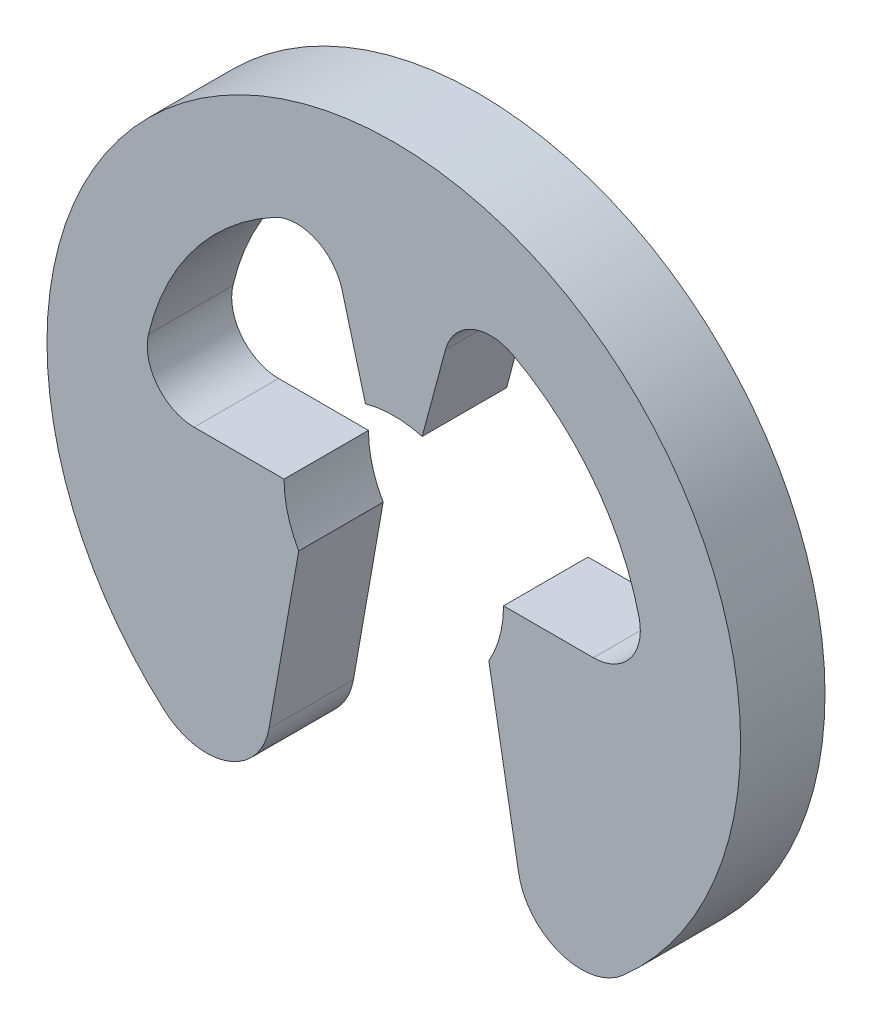
ISO-10303-21;
HEADER;
FILE_DESCRIPTION(('STEP AP214'),'2;1');
FILE_NAME('part.step','',(''),(''),'','','');
FILE_SCHEMA(('AUTOMOTIVE_DESIGN { 1 0 10303 214 1 1 1 1 }'));
ENDSEC;
DATA;
#1=APPLICATION_CONTEXT('core data for automotive mechanical design processes');
#2=APPLICATION_PROTOCOL_DEFINITION('international standard','automotive_design',2000,#1);
#3=PRODUCT_CONTEXT('',#1,'mechanical');
#4=PRODUCT('Part','Part','',(#3));
#5=PRODUCT_RELATED_PRODUCT_CATEGORY('part','',(#4));
#6=PRODUCT_DEFINITION_FORMATION('','',#4);
#7=PRODUCT_DEFINITION_CONTEXT('part definition',#1,'design');
#8=PRODUCT_DEFINITION('design','',#6,#7);
#9=PRODUCT_DEFINITION_SHAPE('','',#8);
#10=(LENGTH_UNIT() NAMED_UNIT(*) SI_UNIT(.MILLI.,.METRE.));
#11=(NAMED_UNIT(*) PLANE_ANGLE_UNIT() SI_UNIT($,.RADIAN.));
#12=(NAMED_UNIT(*) SI_UNIT($,.STERADIAN.) SOLID_ANGLE_UNIT());
#13=UNCERTAINTY_MEASURE_WITH_UNIT(LENGTH_MEASURE(1.E-05),#10,'distance_accuracy_value','');
#14=(GEOMETRIC_REPRESENTATION_CONTEXT(3) GLOBAL_UNCERTAINTY_ASSIGNED_CONTEXT((#13)) GLOBAL_UNIT_ASSIGNED_CONTEXT((#10,
#11,#12)) REPRESENTATION_CONTEXT('',''));
#15=CARTESIAN_POINT('',(0.,0.,0.));
#16=DIRECTION('',(0.,0.,1.));
#17=DIRECTION('',(1.,0.,0.));
#18=AXIS2_PLACEMENT_3D('',#15,#16,#17);
#19=CARTESIAN_POINT('',(0.600538348459495,0.141219936,-0.254));
#20=DIRECTION('',(0.,0.,1.));
#21=DIRECTION('',(1.,0.,0.));
#22=AXIS2_PLACEMENT_3D('',#19,#20,#21);
#23=CYLINDRICAL_SURFACE('',#22,0.141219936000001);
#24=CARTESIAN_POINT('',(0.600538348459495,0.141219936,0.));
#25=DIRECTION('',(0.,0.,-1.));
#26=DIRECTION('',(1.,0.,0.));
#27=AXIS2_PLACEMENT_3D('',#24,#25,#26);
#28=CIRCLE('',#27,0.141219936000001);
#29=CARTESIAN_POINT('',(0.73800850393027,0.173546808392566,0.));
#30=VERTEX_POINT('',#29);
#31=CARTESIAN_POINT('',(0.600538348459495,0.,0.));
#32=VERTEX_POINT('',#31);
#33=EDGE_CURVE('E189',#30,#32,#28,.T.);
#34=ORIENTED_EDGE('',*,*,#33,.F.);
#35=DIRECTION('',(0.,0.,1.));
#36=VECTOR('',#35,1.);
#37=CARTESIAN_POINT('',(0.73800850393027,0.173546808392566,-0.254));
#38=LINE('',#37,#36);
#39=CARTESIAN_POINT('',(0.73800850393027,0.173546808392566,-0.254));
#40=VERTEX_POINT('',#39);
#41=EDGE_CURVE('E11',#40,#30,#38,.T.);
#42=ORIENTED_EDGE('',*,*,#41,.F.);
#43=CARTESIAN_POINT('',(0.600538348459495,0.141219936,-0.254));
#44=DIRECTION('',(0.,0.,-1.));
#45=DIRECTION('',(1.,0.,0.));
#46=AXIS2_PLACEMENT_3D('',#43,#44,#45);
#47=CIRCLE('',#46,0.141219936000001);
#48=CARTESIAN_POINT('',(0.600538348459495,0.,-0.254));
#49=VERTEX_POINT('',#48);
#50=EDGE_CURVE('E239',#40,#49,#47,.T.);
#51=ORIENTED_EDGE('',*,*,#50,.T.);
#52=DIRECTION('',(0.,0.,1.));
#53=VECTOR('',#52,1.);
#54=CARTESIAN_POINT('',(0.600538348459495,0.,-0.254));
#55=LINE('',#54,#53);
#56=EDGE_CURVE('E35',#49,#32,#55,.T.);
#57=ORIENTED_EDGE('',*,*,#56,.T.);
#58=EDGE_LOOP('',(#34,#42,#51,#57));
#59=FACE_BOUND('',#58,.T.);
#60=ADVANCED_FACE('F32',(#59),#23,.F.);
#61=CARTESIAN_POINT('',(0.,0.,-0.254));
#62=DIRECTION('',(0.,0.,1.));
#63=DIRECTION('',(1.,0.,0.));
#64=AXIS2_PLACEMENT_3D('',#61,#62,#63);
#65=CYLINDRICAL_SURFACE('',#64,0.758139200000001);
#66=CARTESIAN_POINT('',(0.,0.,0.));
#67=DIRECTION('',(0.,0.,-1.));
#68=DIRECTION('',(1.,0.,0.));
#69=AXIS2_PLACEMENT_3D('',#66,#67,#68);
#70=CIRCLE('',#69,0.758139200000001);
#71=CARTESIAN_POINT('',(0.358644000561194,0.66794425473845,0.));
#72=VERTEX_POINT('',#71);
#73=EDGE_CURVE('E237',#72,#30,#70,.T.);
#74=ORIENTED_EDGE('',*,*,#73,.F.);
#75=DIRECTION('',(0.,0.,1.));
#76=VECTOR('',#75,1.);
#77=CARTESIAN_POINT('',(0.358644000561194,0.66794425473845,-0.254));
#78=LINE('',#77,#76);
#79=CARTESIAN_POINT('',(0.358644000561194,0.66794425473845,-0.254));
#80=VERTEX_POINT('',#79);
#81=EDGE_CURVE('E41',#80,#72,#78,.T.);
#82=ORIENTED_EDGE('',*,*,#81,.F.);
#83=CARTESIAN_POINT('',(0.,0.,-0.254));
#84=DIRECTION('',(0.,0.,-1.));
#85=DIRECTION('',(1.,0.,0.));
#86=AXIS2_PLACEMENT_3D('',#83,#84,#85);
#87=CIRCLE('',#86,0.758139200000001);
#88=EDGE_CURVE('E179',#80,#40,#87,.T.);
#89=ORIENTED_EDGE('',*,*,#88,.T.);
#90=ORIENTED_EDGE('',*,*,#41,.T.);
#91=EDGE_LOOP('',(#74,#82,#89,#90));
#92=FACE_BOUND('',#91,.T.);
#93=ADVANCED_FACE('F271',(#92),#65,.F.);
#94=CARTESIAN_POINT('',(0.291838745265022,0.543525091469051,-0.254));
#95=DIRECTION('',(0.,0.,1.));
#96=DIRECTION('',(1.,0.,0.));
#97=AXIS2_PLACEMENT_3D('',#94,#95,#96);
#98=CYLINDRICAL_SURFACE('',#97,0.141219936);
#99=CARTESIAN_POINT('',(0.291838745265022,0.543525091469051,0.));
#100=DIRECTION('',(0.,0.,-1.));
#101=DIRECTION('',(1.,0.,0.));
#102=AXIS2_PLACEMENT_3D('',#99,#100,#101);
#103=CIRCLE('',#102,0.141219936);
#104=CARTESIAN_POINT('',(0.155430761895732,0.58007550045401,0.));
#105=VERTEX_POINT('',#104);
#106=EDGE_CURVE('E166',#105,#72,#103,.T.);
#107=ORIENTED_EDGE('',*,*,#106,.F.);
#108=DIRECTION('',(0.,0.,1.));
#109=VECTOR('',#108,1.);
#110=CARTESIAN_POINT('',(0.155430761895732,0.58007550045401,-0.254));
#111=LINE('',#110,#109);
#112=CARTESIAN_POINT('',(0.155430761895732,0.58007550045401,-0.254));
#113=VERTEX_POINT('',#112);
#114=EDGE_CURVE('E161',#113,#105,#111,.T.);
#115=ORIENTED_EDGE('',*,*,#114,.F.);
#116=CARTESIAN_POINT('',(0.291838745265022,0.543525091469051,-0.254));
#117=DIRECTION('',(0.,0.,-1.));
#118=DIRECTION('',(1.,0.,0.));
#119=AXIS2_PLACEMENT_3D('',#116,#117,#118);
#120=CIRCLE('',#119,0.141219936);
#121=EDGE_CURVE('E164',#113,#80,#120,.T.);
#122=ORIENTED_EDGE('',*,*,#121,.T.);
#123=ORIENTED_EDGE('',*,*,#81,.T.);
#124=EDGE_LOOP('',(#107,#115,#122,#123));
#125=FACE_BOUND('',#124,.T.);
#126=ADVANCED_FACE('F163',(#125),#98,.F.);
#127=CARTESIAN_POINT('',(0.0854620486928533,0.31894870784065,-0.254));
#128=DIRECTION('',(0.965925826289069,-0.258819045102519,0.));
#129=DIRECTION('',(0.258819045102519,0.965925826289069,0.));
#130=AXIS2_PLACEMENT_3D('',#127,#128,#129);
#131=PLANE('',#130);
#132=DIRECTION('',(0.258819045102519,0.965925826289069,0.));
#133=VECTOR('',#132,1.);
#134=CARTESIAN_POINT('',(0.0854620486928533,0.31894870784065,0.));
#135=LINE('',#134,#133);
#136=CARTESIAN_POINT('',(0.0854620486928533,0.31894870784065,0.));
#137=VERTEX_POINT('',#136);
#138=EDGE_CURVE('E234',#137,#105,#135,.T.);
#139=ORIENTED_EDGE('',*,*,#138,.F.);
#140=DIRECTION('',(0.,0.,1.));
#141=VECTOR('',#140,1.);
#142=CARTESIAN_POINT('',(0.0854620486928533,0.31894870784065,-0.254));
#143=LINE('',#142,#141);
#144=CARTESIAN_POINT('',(0.0854620486928533,0.31894870784065,-0.254));
#145=VERTEX_POINT('',#144);
#146=EDGE_CURVE('E171',#145,#137,#143,.T.);
#147=ORIENTED_EDGE('',*,*,#146,.F.);
#148=DIRECTION('',(0.258819045102519,0.965925826289069,0.));
#149=VECTOR('',#148,1.);
#150=CARTESIAN_POINT('',(0.0854620486928533,0.31894870784065,-0.254));
#151=LINE('',#150,#149);
#152=EDGE_CURVE('E177',#145,#113,#151,.T.);
#153=ORIENTED_EDGE('',*,*,#152,.T.);
#154=ORIENTED_EDGE('',*,*,#114,.T.);
#155=EDGE_LOOP('',(#139,#147,#153,#154));
#156=FACE_BOUND('',#155,.T.);
#157=ADVANCED_FACE('F181',(#156),#131,.T.);
#158=CARTESIAN_POINT('',(0.,0.,-0.254));
#159=DIRECTION('',(0.,0.,1.));
#160=DIRECTION('',(1.,0.,0.));
#161=AXIS2_PLACEMENT_3D('',#158,#159,#160);
#162=CYLINDRICAL_SURFACE('',#161,0.3302);
#163=CARTESIAN_POINT('',(0.,0.,0.));
#164=DIRECTION('',(0.,0.,-1.));
#165=DIRECTION('',(-1.,0.,0.));
#166=AXIS2_PLACEMENT_3D('',#163,#164,#165);
#167=CIRCLE('',#166,0.3302);
#168=CARTESIAN_POINT('',(-0.0854620486928526,0.31894870784065,0.));
#169=VERTEX_POINT('',#168);
#170=EDGE_CURVE('E231',#169,#137,#167,.T.);
#171=ORIENTED_EDGE('',*,*,#170,.F.);
#172=DIRECTION('',(0.,0.,1.));
#173=VECTOR('',#172,1.);
#174=CARTESIAN_POINT('',(-0.0854620486928526,0.31894870784065,-0.254));
#175=LINE('',#174,#173);
#176=CARTESIAN_POINT('',(-0.0854620486928526,0.31894870784065,-0.254));
#177=VERTEX_POINT('',#176);
#178=EDGE_CURVE('E243',#177,#169,#175,.T.);
#179=ORIENTED_EDGE('',*,*,#178,.F.);
#180=CARTESIAN_POINT('',(0.,0.,-0.254));
#181=DIRECTION('',(0.,0.,-1.));
#182=DIRECTION('',(-1.,0.,0.));
#183=AXIS2_PLACEMENT_3D('',#180,#181,#182);
#184=CIRCLE('',#183,0.3302);
#185=EDGE_CURVE('E182',#177,#145,#184,.T.);
#186=ORIENTED_EDGE('',*,*,#185,.T.);
#187=ORIENTED_EDGE('',*,*,#146,.T.);
#188=EDGE_LOOP('',(#171,#179,#186,#187));
#189=FACE_BOUND('',#188,.T.);
#190=ADVANCED_FACE('F284',(#189),#162,.F.);
#191=CARTESIAN_POINT('',(-0.0854620486928526,0.31894870784065,-0.254));
#192=DIRECTION('',(-0.965925826289068,-0.258819045102522,0.));
#193=DIRECTION('',(0.258819045102522,-0.965925826289068,0.));
#194=AXIS2_PLACEMENT_3D('',#191,#192,#193);
#195=PLANE('',#194);
#196=DIRECTION('',(0.258819045102522,-0.965925826289068,0.));
#197=VECTOR('',#196,1.);
#198=CARTESIAN_POINT('',(-0.0854620486928526,0.31894870784065,0.));
#199=LINE('',#198,#197);
#200=CARTESIAN_POINT('',(-0.155430761895732,0.58007550045401,0.));
#201=VERTEX_POINT('',#200);
#202=EDGE_CURVE('E228',#201,#169,#199,.T.);
#203=ORIENTED_EDGE('',*,*,#202,.F.);
#204=DIRECTION('',(0.,0.,1.));
#205=VECTOR('',#204,1.);
#206=CARTESIAN_POINT('',(-0.155430761895732,0.58007550045401,-0.254));
#207=LINE('',#206,#205);
#208=CARTESIAN_POINT('',(-0.155430761895732,0.58007550045401,-0.254));
#209=VERTEX_POINT('',#208);
#210=EDGE_CURVE('E245',#209,#201,#207,.T.);
#211=ORIENTED_EDGE('',*,*,#210,.F.);
#212=DIRECTION('',(0.258819045102522,-0.965925826289068,0.));
#213=VECTOR('',#212,1.);
#214=CARTESIAN_POINT('',(-0.0854620486928526,0.31894870784065,-0.254));
#215=LINE('',#214,#213);
#216=EDGE_CURVE('E184',#209,#177,#215,.T.);
#217=ORIENTED_EDGE('',*,*,#216,.T.);
#218=ORIENTED_EDGE('',*,*,#178,.T.);
#219=EDGE_LOOP('',(#203,#211,#217,#218));
#220=FACE_BOUND('',#219,.T.);
#221=ADVANCED_FACE('F287',(#220),#195,.T.);
#222=CARTESIAN_POINT('',(-0.291838745265022,0.543525091469051,-0.254));
#223=DIRECTION('',(0.,0.,1.));
#224=DIRECTION('',(1.,0.,0.));
#225=AXIS2_PLACEMENT_3D('',#222,#223,#224);
#226=CYLINDRICAL_SURFACE('',#225,0.141219936);
#227=CARTESIAN_POINT('',(-0.291838745265022,0.543525091469051,0.));
#228=DIRECTION('',(0.,0.,-1.));
#229=DIRECTION('',(1.,0.,0.));
#230=AXIS2_PLACEMENT_3D('',#227,#228,#229);
#231=CIRCLE('',#230,0.141219936);
#232=CARTESIAN_POINT('',(-0.358644000561193,0.66794425473845,0.));
#233=VERTEX_POINT('',#232);
#234=EDGE_CURVE('E225',#233,#201,#231,.T.);
#235=ORIENTED_EDGE('',*,*,#234,.F.);
#236=DIRECTION('',(0.,0.,1.));
#237=VECTOR('',#236,1.);
#238=CARTESIAN_POINT('',(-0.358644000561193,0.66794425473845,-0.254));
#239=LINE('',#238,#237);
#240=CARTESIAN_POINT('',(-0.358644000561193,0.66794425473845,-0.254));
#241=VERTEX_POINT('',#240);
#242=EDGE_CURVE('E247',#241,#233,#239,.T.);
#243=ORIENTED_EDGE('',*,*,#242,.F.);
#244=CARTESIAN_POINT('',(-0.291838745265022,0.543525091469051,-0.254));
#245=DIRECTION('',(0.,0.,-1.));
#246=DIRECTION('',(1.,0.,0.));
#247=AXIS2_PLACEMENT_3D('',#244,#245,#246);
#248=CIRCLE('',#247,0.141219936);
#249=EDGE_CURVE('E495',#241,#209,#248,.T.);
#250=ORIENTED_EDGE('',*,*,#249,.T.);
#251=ORIENTED_EDGE('',*,*,#210,.T.);
#252=EDGE_LOOP('',(#235,#243,#250,#251));
#253=FACE_BOUND('',#252,.T.);
#254=ADVANCED_FACE('F291',(#253),#226,.F.);
#255=CARTESIAN_POINT('',(0.,0.,-0.254));
#256=DIRECTION('',(0.,0.,1.));
#257=DIRECTION('',(1.,0.,0.));
#258=AXIS2_PLACEMENT_3D('',#255,#256,#257);
#259=CYLINDRICAL_SURFACE('',#258,0.758139200000001);
#260=CARTESIAN_POINT('',(0.,0.,0.));
#261=DIRECTION('',(0.,0.,-1.));
#262=DIRECTION('',(1.,0.,0.));
#263=AXIS2_PLACEMENT_3D('',#260,#261,#262);
#264=CIRCLE('',#263,0.758139200000001);
#265=CARTESIAN_POINT('',(-0.73800850393027,0.173546808392568,0.));
#266=VERTEX_POINT('',#265);
#267=EDGE_CURVE('E222',#266,#233,#264,.T.);
#268=ORIENTED_EDGE('',*,*,#267,.F.);
#269=DIRECTION('',(0.,0.,1.));
#270=VECTOR('',#269,1.);
#271=CARTESIAN_POINT('',(-0.73800850393027,0.173546808392568,-0.254));
#272=LINE('',#271,#270);
#273=CARTESIAN_POINT('',(-0.73800850393027,0.173546808392568,-0.254));
#274=VERTEX_POINT('',#273);
#275=EDGE_CURVE('E249',#274,#266,#272,.T.);
#276=ORIENTED_EDGE('',*,*,#275,.F.);
#277=CARTESIAN_POINT('',(0.,0.,-0.254));
#278=DIRECTION('',(0.,0.,-1.));
#279=DIRECTION('',(1.,0.,0.));
#280=AXIS2_PLACEMENT_3D('',#277,#278,#279);
#281=CIRCLE('',#280,0.758139200000001);
#282=EDGE_CURVE('E499',#274,#241,#281,.T.);
#283=ORIENTED_EDGE('',*,*,#282,.T.);
#284=ORIENTED_EDGE('',*,*,#242,.T.);
#285=EDGE_LOOP('',(#268,#276,#283,#284));
#286=FACE_BOUND('',#285,.T.);
#287=ADVANCED_FACE('F295',(#286),#259,.F.);
#288=CARTESIAN_POINT('',(-0.600538348459495,0.141219936000002,-0.254));
#289=DIRECTION('',(0.,0.,1.));
#290=DIRECTION('',(1.,0.,0.));
#291=AXIS2_PLACEMENT_3D('',#288,#289,#290);
#292=CYLINDRICAL_SURFACE('',#291,0.141219936000002);
#293=CARTESIAN_POINT('',(-0.600538348459495,0.141219936000002,0.));
#294=DIRECTION('',(0.,0.,-1.));
#295=DIRECTION('',(1.,0.,0.));
#296=AXIS2_PLACEMENT_3D('',#293,#294,#295);
#297=CIRCLE('',#296,0.141219936000002);
#298=CARTESIAN_POINT('',(-0.600538348459495,0.,0.));
#299=VERTEX_POINT('',#298);
#300=EDGE_CURVE('E219',#299,#266,#297,.T.);
#301=ORIENTED_EDGE('',*,*,#300,.F.);
#302=DIRECTION('',(0.,0.,1.));
#303=VECTOR('',#302,1.);
#304=CARTESIAN_POINT('',(-0.600538348459495,0.,-0.254));
#305=LINE('',#304,#303);
#306=CARTESIAN_POINT('',(-0.600538348459495,0.,-0.254));
#307=VERTEX_POINT('',#306);
#308=EDGE_CURVE('E251',#307,#299,#305,.T.);
#309=ORIENTED_EDGE('',*,*,#308,.F.);
#310=CARTESIAN_POINT('',(-0.600538348459495,0.141219936000002,-0.254));
#311=DIRECTION('',(0.,0.,-1.));
#312=DIRECTION('',(1.,0.,0.));
#313=AXIS2_PLACEMENT_3D('',#310,#311,#312);
#314=CIRCLE('',#313,0.141219936000002);
#315=EDGE_CURVE('E488',#307,#274,#314,.T.);
#316=ORIENTED_EDGE('',*,*,#315,.T.);
#317=ORIENTED_EDGE('',*,*,#275,.T.);
#318=EDGE_LOOP('',(#301,#309,#316,#317));
#319=FACE_BOUND('',#318,.T.);
#320=ADVANCED_FACE('F299',(#319),#292,.F.);
#321=CARTESIAN_POINT('',(-0.330199999999999,0.,-0.254));
#322=DIRECTION('',(0.,1.,0.));
#323=DIRECTION('',(0.,0.,1.));
#324=AXIS2_PLACEMENT_3D('',#321,#322,#323);
#325=PLANE('',#324);
#326=DIRECTION('',(-1.,0.,0.));
#327=VECTOR('',#326,1.);
#328=CARTESIAN_POINT('',(-0.330199999999999,0.,0.));
#329=LINE('',#328,#327);
#330=CARTESIAN_POINT('',(-0.330199999999999,0.,0.));
#331=VERTEX_POINT('',#330);
#332=EDGE_CURVE('E216',#331,#299,#329,.T.);
#333=ORIENTED_EDGE('',*,*,#332,.F.);
#334=DIRECTION('',(0.,0.,1.));
#335=VECTOR('',#334,1.);
#336=CARTESIAN_POINT('',(-0.330199999999999,0.,-0.254));
#337=LINE('',#336,#335);
#338=CARTESIAN_POINT('',(-0.330199999999999,0.,-0.254));
#339=VERTEX_POINT('',#338);
#340=EDGE_CURVE('E253',#339,#331,#337,.T.);
#341=ORIENTED_EDGE('',*,*,#340,.F.);
#342=DIRECTION('',(-1.,0.,0.));
#343=VECTOR('',#342,1.);
#344=CARTESIAN_POINT('',(-0.330199999999999,0.,-0.254));
#345=LINE('',#344,#343);
#346=EDGE_CURVE('E484',#339,#307,#345,.T.);
#347=ORIENTED_EDGE('',*,*,#346,.T.);
#348=ORIENTED_EDGE('',*,*,#308,.T.);
#349=EDGE_LOOP('',(#333,#341,#347,#348));
#350=FACE_BOUND('',#349,.T.);
#351=ADVANCED_FACE('F303',(#350),#325,.T.);
#352=CARTESIAN_POINT('',(0.,0.,-0.254));
#353=DIRECTION('',(0.,0.,1.));
#354=DIRECTION('',(1.,0.,0.));
#355=AXIS2_PLACEMENT_3D('',#352,#353,#354);
#356=CYLINDRICAL_SURFACE('',#355,0.330199999999999);
#357=CARTESIAN_POINT('',(0.,0.,0.));
#358=DIRECTION('',(0.,0.,-1.));
#359=DIRECTION('',(1.,0.,0.));
#360=AXIS2_PLACEMENT_3D('',#357,#358,#359);
#361=CIRCLE('',#360,0.330199999999999);
#362=CARTESIAN_POINT('',(-0.285961588329621,-0.1651,0.));
#363=VERTEX_POINT('',#362);
#364=EDGE_CURVE('E213',#363,#331,#361,.T.);
#365=ORIENTED_EDGE('',*,*,#364,.F.);
#366=DIRECTION('',(0.,0.,1.));
#367=VECTOR('',#366,1.);
#368=CARTESIAN_POINT('',(-0.285961588329621,-0.1651,-0.254));
#369=LINE('',#368,#367);
#370=CARTESIAN_POINT('',(-0.285961588329621,-0.1651,-0.254));
#371=VERTEX_POINT('',#370);
#372=EDGE_CURVE('E255',#371,#363,#369,.T.);
#373=ORIENTED_EDGE('',*,*,#372,.F.);
#374=CARTESIAN_POINT('',(0.,0.,-0.254));
#375=DIRECTION('',(0.,0.,-1.));
#376=DIRECTION('',(1.,0.,0.));
#377=AXIS2_PLACEMENT_3D('',#374,#375,#376);
#378=CIRCLE('',#377,0.330199999999999);
#379=EDGE_CURVE('E505',#371,#339,#378,.T.);
#380=ORIENTED_EDGE('',*,*,#379,.T.);
#381=ORIENTED_EDGE('',*,*,#340,.T.);
#382=EDGE_LOOP('',(#365,#373,#380,#381));
#383=FACE_BOUND('',#382,.T.);
#384=ADVANCED_FACE('F307',(#383),#356,.F.);
#385=CARTESIAN_POINT('',(-0.285961588329621,-0.1651,-0.254));
#386=DIRECTION('',(0.984807753012208,-0.17364817766693,0.));
#387=DIRECTION('',(0.17364817766693,0.984807753012208,0.));
#388=AXIS2_PLACEMENT_3D('',#385,#386,#387);
#389=PLANE('',#388);
#390=DIRECTION('',(0.17364817766693,0.984807753012208,0.));
#391=VECTOR('',#390,1.);
#392=CARTESIAN_POINT('',(-0.285961588329621,-0.1651,0.));
#393=LINE('',#392,#391);
#394=CARTESIAN_POINT('',(-0.375423974695196,-0.672466405334703,0.));
#395=VERTEX_POINT('',#394);
#396=EDGE_CURVE('E210',#395,#363,#393,.T.);
#397=ORIENTED_EDGE('',*,*,#396,.F.);
#398=DIRECTION('',(0.,0.,1.));
#399=VECTOR('',#398,1.);
#400=CARTESIAN_POINT('',(-0.375423974695196,-0.672466405334703,-0.254));
#401=LINE('',#400,#399);
#402=CARTESIAN_POINT('',(-0.375423974695196,-0.672466405334703,-0.254));
#403=VERTEX_POINT('',#402);
#404=EDGE_CURVE('E257',#403,#395,#401,.T.);
#405=ORIENTED_EDGE('',*,*,#404,.F.);
#406=DIRECTION('',(0.17364817766693,0.984807753012208,0.));
#407=VECTOR('',#406,1.);
#408=CARTESIAN_POINT('',(-0.285961588329621,-0.1651,-0.254));
#409=LINE('',#408,#407);
#410=EDGE_CURVE('E477',#403,#371,#409,.T.);
#411=ORIENTED_EDGE('',*,*,#410,.T.);
#412=ORIENTED_EDGE('',*,*,#372,.T.);
#413=EDGE_LOOP('',(#397,#405,#411,#412));
#414=FACE_BOUND('',#413,.T.);
#415=ADVANCED_FACE('F311',(#414),#389,.T.);
#416=CARTESIAN_POINT('',(-0.563666210778632,-0.639274220204301,-0.254));
#417=DIRECTION('',(0.,0.,1.));
#418=DIRECTION('',(1.,0.,0.));
#419=AXIS2_PLACEMENT_3D('',#416,#417,#418);
#420=CYLINDRICAL_SURFACE('',#419,0.191146176);
#421=CARTESIAN_POINT('',(-0.563666210778632,-0.639274220204301,0.));
#422=DIRECTION('',(0.,0.,1.));
#423=DIRECTION('',(1.,0.,0.));
#424=AXIS2_PLACEMENT_3D('',#421,#422,#423);
#425=CIRCLE('',#424,0.191146176);
#426=CARTESIAN_POINT('',(-0.690082299955242,-0.782647275541468,0.));
#427=VERTEX_POINT('',#426);
#428=EDGE_CURVE('E207',#427,#395,#425,.T.);
#429=ORIENTED_EDGE('',*,*,#428,.F.);
#430=DIRECTION('',(0.,0.,1.));
#431=VECTOR('',#430,1.);
#432=CARTESIAN_POINT('',(-0.690082299955242,-0.782647275541468,-0.254));
#433=LINE('',#432,#431);
#434=CARTESIAN_POINT('',(-0.690082299955242,-0.782647275541468,-0.254));
#435=VERTEX_POINT('',#434);
#436=EDGE_CURVE('E259',#435,#427,#433,.T.);
#437=ORIENTED_EDGE('',*,*,#436,.F.);
#438=CARTESIAN_POINT('',(-0.563666210778632,-0.639274220204301,-0.254));
#439=DIRECTION('',(0.,0.,1.));
#440=DIRECTION('',(1.,0.,0.));
#441=AXIS2_PLACEMENT_3D('',#438,#439,#440);
#442=CIRCLE('',#441,0.191146176);
#443=EDGE_CURVE('E473',#435,#403,#442,.T.);
#444=ORIENTED_EDGE('',*,*,#443,.T.);
#445=ORIENTED_EDGE('',*,*,#404,.T.);
#446=EDGE_LOOP('',(#429,#437,#444,#445));
#447=FACE_BOUND('',#446,.T.);
#448=ADVANCED_FACE('F315',(#447),#420,.T.);
#449=CARTESIAN_POINT('',(0.,0.,-0.254));
#450=DIRECTION('',(0.,0.,1.));
#451=DIRECTION('',(1.,0.,0.));
#452=AXIS2_PLACEMENT_3D('',#449,#450,#451);
#453=CYLINDRICAL_SURFACE('',#452,1.043432);
#454=CARTESIAN_POINT('',(0.,0.,0.));
#455=DIRECTION('',(0.,0.,1.));
#456=DIRECTION('',(1.,0.,0.));
#457=AXIS2_PLACEMENT_3D('',#454,#455,#456);
#458=CIRCLE('',#457,1.043432);
#459=CARTESIAN_POINT('',(0.690082299955243,-0.782647275541469,0.));
#460=VERTEX_POINT('',#459);
#461=EDGE_CURVE('E204',#460,#427,#458,.T.);
#462=ORIENTED_EDGE('',*,*,#461,.F.);
#463=DIRECTION('',(0.,0.,1.));
#464=VECTOR('',#463,1.);
#465=CARTESIAN_POINT('',(0.690082299955243,-0.782647275541469,-0.254));
#466=LINE('',#465,#464);
#467=CARTESIAN_POINT('',(0.690082299955243,-0.782647275541469,-0.254));
#468=VERTEX_POINT('',#467);
#469=EDGE_CURVE('E261',#468,#460,#466,.T.);
#470=ORIENTED_EDGE('',*,*,#469,.F.);
#471=CARTESIAN_POINT('',(0.,0.,-0.254));
#472=DIRECTION('',(0.,0.,1.));
#473=DIRECTION('',(1.,0.,0.));
#474=AXIS2_PLACEMENT_3D('',#471,#472,#473);
#475=CIRCLE('',#474,1.043432);
#476=EDGE_CURVE('E509',#468,#435,#475,.T.);
#477=ORIENTED_EDGE('',*,*,#476,.T.);
#478=ORIENTED_EDGE('',*,*,#436,.T.);
#479=EDGE_LOOP('',(#462,#470,#477,#478));
#480=FACE_BOUND('',#479,.T.);
#481=ADVANCED_FACE('F319',(#480),#453,.T.);
#482=CARTESIAN_POINT('',(0.563666210778632,-0.639274220204301,-0.254));
#483=DIRECTION('',(0.,0.,1.));
#484=DIRECTION('',(1.,0.,0.));
#485=AXIS2_PLACEMENT_3D('',#482,#483,#484);
#486=CYLINDRICAL_SURFACE('',#485,0.191146176);
#487=CARTESIAN_POINT('',(0.563666210778632,-0.639274220204301,0.));
#488=DIRECTION('',(0.,0.,1.));
#489=DIRECTION('',(1.,0.,0.));
#490=AXIS2_PLACEMENT_3D('',#487,#488,#489);
#491=CIRCLE('',#490,0.191146176);
#492=CARTESIAN_POINT('',(0.375423974695195,-0.672466405334703,0.));
#493=VERTEX_POINT('',#492);
#494=EDGE_CURVE('E201',#493,#460,#491,.T.);
#495=ORIENTED_EDGE('',*,*,#494,.F.);
#496=DIRECTION('',(0.,0.,1.));
#497=VECTOR('',#496,1.);
#498=CARTESIAN_POINT('',(0.375423974695195,-0.672466405334703,-0.254));
#499=LINE('',#498,#497);
#500=CARTESIAN_POINT('',(0.375423974695195,-0.672466405334703,-0.254));
#501=VERTEX_POINT('',#500);
#502=EDGE_CURVE('E263',#501,#493,#499,.T.);
#503=ORIENTED_EDGE('',*,*,#502,.F.);
#504=CARTESIAN_POINT('',(0.563666210778632,-0.639274220204301,-0.254));
#505=DIRECTION('',(0.,0.,1.));
#506=DIRECTION('',(1.,0.,0.));
#507=AXIS2_PLACEMENT_3D('',#504,#505,#506);
#508=CIRCLE('',#507,0.191146176);
#509=EDGE_CURVE('E466',#501,#468,#508,.T.);
#510=ORIENTED_EDGE('',*,*,#509,.T.);
#511=ORIENTED_EDGE('',*,*,#469,.T.);
#512=EDGE_LOOP('',(#495,#503,#510,#511));
#513=FACE_BOUND('',#512,.T.);
#514=ADVANCED_FACE('F323',(#513),#486,.T.);
#515=CARTESIAN_POINT('',(0.285961588329621,-0.1651,-0.254));
#516=DIRECTION('',(-0.984807753012208,-0.17364817766693,0.));
#517=DIRECTION('',(0.17364817766693,-0.984807753012208,0.));
#518=AXIS2_PLACEMENT_3D('',#515,#516,#517);
#519=PLANE('',#518);
#520=DIRECTION('',(0.17364817766693,-0.984807753012208,0.));
#521=VECTOR('',#520,1.);
#522=CARTESIAN_POINT('',(0.285961588329621,-0.1651,0.));
#523=LINE('',#522,#521);
#524=CARTESIAN_POINT('',(0.285961588329621,-0.1651,0.));
#525=VERTEX_POINT('',#524);
#526=EDGE_CURVE('E198',#525,#493,#523,.T.);
#527=ORIENTED_EDGE('',*,*,#526,.F.);
#528=DIRECTION('',(0.,0.,1.));
#529=VECTOR('',#528,1.);
#530=CARTESIAN_POINT('',(0.285961588329621,-0.1651,-0.254));
#531=LINE('',#530,#529);
#532=CARTESIAN_POINT('',(0.285961588329621,-0.1651,-0.254));
#533=VERTEX_POINT('',#532);
#534=EDGE_CURVE('E265',#533,#525,#531,.T.);
#535=ORIENTED_EDGE('',*,*,#534,.F.);
#536=DIRECTION('',(0.17364817766693,-0.984807753012208,0.));
#537=VECTOR('',#536,1.);
#538=CARTESIAN_POINT('',(0.285961588329621,-0.1651,-0.254));
#539=LINE('',#538,#537);
#540=EDGE_CURVE('E462',#533,#501,#539,.T.);
#541=ORIENTED_EDGE('',*,*,#540,.T.);
#542=ORIENTED_EDGE('',*,*,#502,.T.);
#543=EDGE_LOOP('',(#527,#535,#541,#542));
#544=FACE_BOUND('',#543,.T.);
#545=ADVANCED_FACE('F327',(#544),#519,.T.);
#546=CARTESIAN_POINT('',(0.,0.,-0.254));
#547=DIRECTION('',(0.,0.,1.));
#548=DIRECTION('',(1.,0.,0.));
#549=AXIS2_PLACEMENT_3D('',#546,#547,#548);
#550=CYLINDRICAL_SURFACE('',#549,0.330199999999999);
#551=CARTESIAN_POINT('',(0.,0.,0.));
#552=DIRECTION('',(0.,0.,-1.));
#553=DIRECTION('',(1.,0.,0.));
#554=AXIS2_PLACEMENT_3D('',#551,#552,#553);
#555=CIRCLE('',#554,0.330199999999999);
#556=CARTESIAN_POINT('',(0.330199999999999,0.,0.));
#557=VERTEX_POINT('',#556);
#558=EDGE_CURVE('E195',#557,#525,#555,.T.);
#559=ORIENTED_EDGE('',*,*,#558,.F.);
#560=DIRECTION('',(0.,0.,1.));
#561=VECTOR('',#560,1.);
#562=CARTESIAN_POINT('',(0.330199999999999,0.,-0.254));
#563=LINE('',#562,#561);
#564=CARTESIAN_POINT('',(0.330199999999999,0.,-0.254));
#565=VERTEX_POINT('',#564);
#566=EDGE_CURVE('E266',#565,#557,#563,.T.);
#567=ORIENTED_EDGE('',*,*,#566,.F.);
#568=CARTESIAN_POINT('',(0.,0.,-0.254));
#569=DIRECTION('',(0.,0.,-1.));
#570=DIRECTION('',(1.,0.,0.));
#571=AXIS2_PLACEMENT_3D('',#568,#569,#570);
#572=CIRCLE('',#571,0.330199999999999);
#573=EDGE_CURVE('E513',#565,#533,#572,.T.);
#574=ORIENTED_EDGE('',*,*,#573,.T.);
#575=ORIENTED_EDGE('',*,*,#534,.T.);
#576=EDGE_LOOP('',(#559,#567,#574,#575));
#577=FACE_BOUND('',#576,.T.);
#578=ADVANCED_FACE('F331',(#577),#550,.F.);
#579=CARTESIAN_POINT('',(0.330199999999999,0.,-0.254));
#580=DIRECTION('',(0.,1.,0.));
#581=DIRECTION('',(0.,0.,1.));
#582=AXIS2_PLACEMENT_3D('',#579,#580,#581);
#583=PLANE('',#582);
#584=DIRECTION('',(-1.,0.,0.));
#585=VECTOR('',#584,1.);
#586=CARTESIAN_POINT('',(0.330199999999999,0.,0.));
#587=LINE('',#586,#585);
#588=EDGE_CURVE('E192',#32,#557,#587,.T.);
#589=ORIENTED_EDGE('',*,*,#588,.F.);
#590=ORIENTED_EDGE('',*,*,#56,.F.);
#591=DIRECTION('',(-1.,0.,0.));
#592=VECTOR('',#591,1.);
#593=CARTESIAN_POINT('',(0.330199999999999,0.,-0.254));
#594=LINE('',#593,#592);
#595=EDGE_CURVE('E515',#49,#565,#594,.T.);
#596=ORIENTED_EDGE('',*,*,#595,.T.);
#597=ORIENTED_EDGE('',*,*,#566,.T.);
#598=EDGE_LOOP('',(#589,#590,#596,#597));
#599=FACE_BOUND('',#598,.T.);
#600=ADVANCED_FACE('F268',(#599),#583,.T.);
#601=CARTESIAN_POINT('',(0.600538348459495,0.141219936,-0.254));
#602=DIRECTION('',(0.,0.,1.));
#603=DIRECTION('',(1.,0.,0.));
#604=AXIS2_PLACEMENT_3D('',#601,#602,#603);
#605=PLANE('',#604);
#606=ORIENTED_EDGE('',*,*,#50,.F.);
#607=ORIENTED_EDGE('',*,*,#88,.F.);
#608=ORIENTED_EDGE('',*,*,#121,.F.);
#609=ORIENTED_EDGE('',*,*,#152,.F.);
#610=ORIENTED_EDGE('',*,*,#185,.F.);
#611=ORIENTED_EDGE('',*,*,#216,.F.);
#612=ORIENTED_EDGE('',*,*,#249,.F.);
#613=ORIENTED_EDGE('',*,*,#282,.F.);
#614=ORIENTED_EDGE('',*,*,#315,.F.);
#615=ORIENTED_EDGE('',*,*,#346,.F.);
#616=ORIENTED_EDGE('',*,*,#379,.F.);
#617=ORIENTED_EDGE('',*,*,#410,.F.);
#618=ORIENTED_EDGE('',*,*,#443,.F.);
#619=ORIENTED_EDGE('',*,*,#476,.F.);
#620=ORIENTED_EDGE('',*,*,#509,.F.);
#621=ORIENTED_EDGE('',*,*,#540,.F.);
#622=ORIENTED_EDGE('',*,*,#573,.F.);
#623=ORIENTED_EDGE('',*,*,#595,.F.);
#624=EDGE_LOOP('',(#606,#607,#608,#609,#610,#611,#612,#613,#614,#615,#616,#617,#618,#619,#620,
#621,#622,#623));
#625=FACE_BOUND('',#624,.T.);
#626=ADVANCED_FACE('F175',(#625),#605,.F.);
#627=CARTESIAN_POINT('',(0.600538348459495,0.141219936,0.));
#628=DIRECTION('',(0.,0.,1.));
#629=DIRECTION('',(1.,0.,0.));
#630=AXIS2_PLACEMENT_3D('',#627,#628,#629);
#631=PLANE('',#630);
#632=ORIENTED_EDGE('',*,*,#33,.T.);
#633=ORIENTED_EDGE('',*,*,#588,.T.);
#634=ORIENTED_EDGE('',*,*,#558,.T.);
#635=ORIENTED_EDGE('',*,*,#526,.T.);
#636=ORIENTED_EDGE('',*,*,#494,.T.);
#637=ORIENTED_EDGE('',*,*,#461,.T.);
#638=ORIENTED_EDGE('',*,*,#428,.T.);
#639=ORIENTED_EDGE('',*,*,#396,.T.);
#640=ORIENTED_EDGE('',*,*,#364,.T.);
#641=ORIENTED_EDGE('',*,*,#332,.T.);
#642=ORIENTED_EDGE('',*,*,#300,.T.);
#643=ORIENTED_EDGE('',*,*,#267,.T.);
#644=ORIENTED_EDGE('',*,*,#234,.T.);
#645=ORIENTED_EDGE('',*,*,#202,.T.);
#646=ORIENTED_EDGE('',*,*,#170,.T.);
#647=ORIENTED_EDGE('',*,*,#138,.T.);
#648=ORIENTED_EDGE('',*,*,#106,.T.);
#649=ORIENTED_EDGE('',*,*,#73,.T.);
#650=EDGE_LOOP('',(#632,#633,#634,#635,#636,#637,#638,#639,#640,#641,#642,#643,#644,#645,#646,
#647,#648,#649));
#651=FACE_BOUND('',#650,.T.);
#652=ADVANCED_FACE('F270',(#651),#631,.T.);
#653=CLOSED_SHELL('',(#60,#93,#126,#157,#190,#221,#254,#287,#320,#351,#384,#415,#448,#481,#514,
#545,#578,#600,#626,#652));
#654=MANIFOLD_SOLID_BREP('B2',#653);
#655=ADVANCED_BREP_SHAPE_REPRESENTATION('',(#18,#654),#14);
#656=SHAPE_DEFINITION_REPRESENTATION(#9,#655);
ENDSEC;
END-ISO-10303-21;
